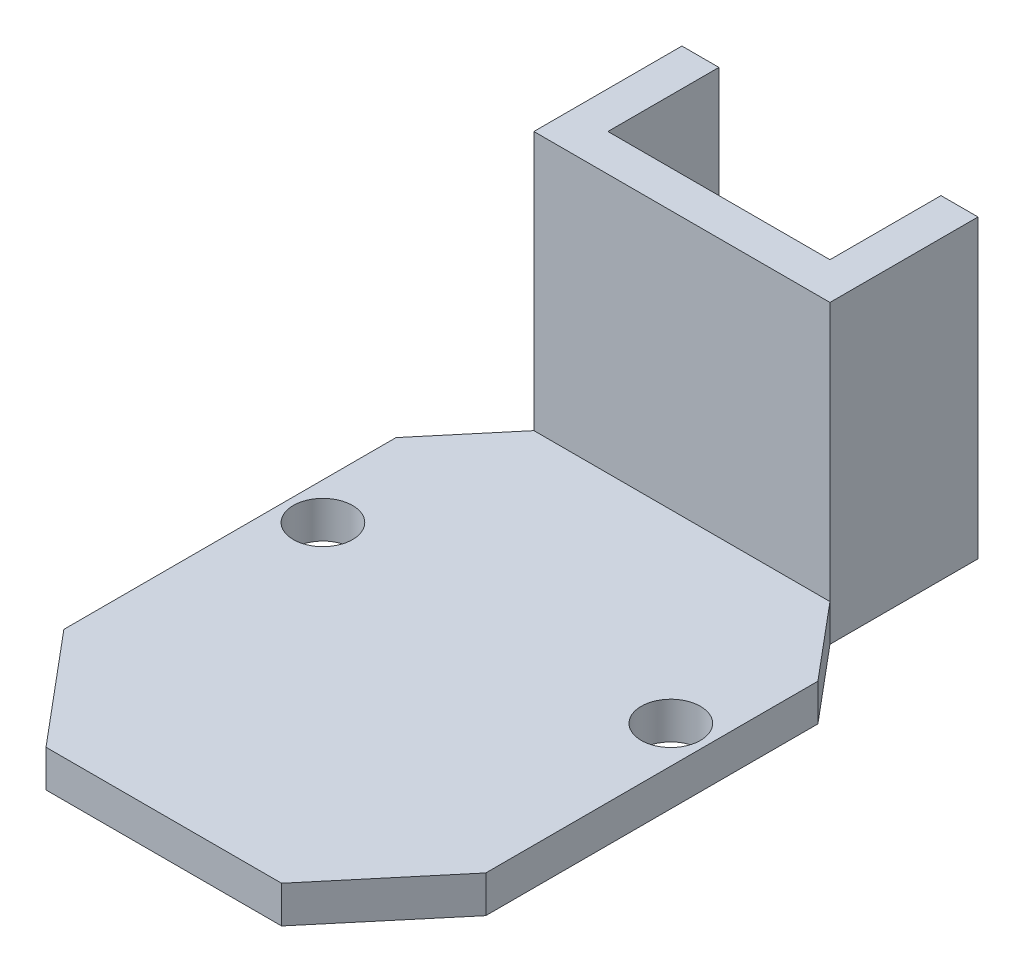
ISO-10303-21;
HEADER;
FILE_DESCRIPTION(('STEP AP214'),'2;1');
FILE_NAME('part.step','',(''),(''),'','','');
FILE_SCHEMA(('AUTOMOTIVE_DESIGN { 1 0 10303 214 1 1 1 1 }'));
ENDSEC;
DATA;
#1=APPLICATION_CONTEXT('core data for automotive mechanical design processes');
#2=APPLICATION_PROTOCOL_DEFINITION('international standard','automotive_design',2000,#1);
#3=PRODUCT_CONTEXT('',#1,'mechanical');
#4=PRODUCT('Part','Part','',(#3));
#5=PRODUCT_RELATED_PRODUCT_CATEGORY('part','',(#4));
#6=PRODUCT_DEFINITION_FORMATION('','',#4);
#7=PRODUCT_DEFINITION_CONTEXT('part definition',#1,'design');
#8=PRODUCT_DEFINITION('design','',#6,#7);
#9=PRODUCT_DEFINITION_SHAPE('','',#8);
#10=(LENGTH_UNIT() NAMED_UNIT(*) SI_UNIT(.MILLI.,.METRE.));
#11=(NAMED_UNIT(*) PLANE_ANGLE_UNIT() SI_UNIT($,.RADIAN.));
#12=(NAMED_UNIT(*) SI_UNIT($,.STERADIAN.) SOLID_ANGLE_UNIT());
#13=UNCERTAINTY_MEASURE_WITH_UNIT(LENGTH_MEASURE(1.E-05),#10,'distance_accuracy_value','');
#14=(GEOMETRIC_REPRESENTATION_CONTEXT(3) GLOBAL_UNCERTAINTY_ASSIGNED_CONTEXT((#13)) GLOBAL_UNIT_ASSIGNED_CONTEXT((#10,
#11,#12)) REPRESENTATION_CONTEXT('',''));
#15=CARTESIAN_POINT('',(0.,0.,0.));
#16=DIRECTION('',(0.,0.,1.));
#17=DIRECTION('',(1.,0.,0.));
#18=AXIS2_PLACEMENT_3D('',#15,#16,#17);
#19=CARTESIAN_POINT('',(0.,0.,20.));
#20=DIRECTION('',(0.,0.,-1.));
#21=DIRECTION('',(-1.,0.,0.));
#22=AXIS2_PLACEMENT_3D('',#19,#20,#21);
#23=PLANE('',#22);
#24=DIRECTION('',(-1.,0.,0.));
#25=VECTOR('',#24,1.);
#26=CARTESIAN_POINT('',(-8.5,5.,20.));
#27=LINE('',#26,#25);
#28=CARTESIAN_POINT('',(40.,5.,20.));
#29=VERTEX_POINT('',#28);
#30=CARTESIAN_POINT('',(0.,5.,20.));
#31=VERTEX_POINT('',#30);
#32=EDGE_CURVE('E146',#29,#31,#27,.T.);
#33=ORIENTED_EDGE('',*,*,#32,.F.);
#34=DIRECTION('',(0.,1.,0.));
#35=VECTOR('',#34,1.);
#36=CARTESIAN_POINT('',(40.,40.,20.));
#37=LINE('',#36,#35);
#38=CARTESIAN_POINT('',(40.,40.,20.));
#39=VERTEX_POINT('',#38);
#40=EDGE_CURVE('E226',#29,#39,#37,.T.);
#41=ORIENTED_EDGE('',*,*,#40,.T.);
#42=DIRECTION('',(-1.,0.,0.));
#43=VECTOR('',#42,1.);
#44=CARTESIAN_POINT('',(0.,40.,20.));
#45=LINE('',#44,#43);
#46=CARTESIAN_POINT('',(0.,40.,20.));
#47=VERTEX_POINT('',#46);
#48=EDGE_CURVE('E149',#39,#47,#45,.T.);
#49=ORIENTED_EDGE('',*,*,#48,.T.);
#50=DIRECTION('',(0.,-1.,0.));
#51=VECTOR('',#50,1.);
#52=CARTESIAN_POINT('',(0.,0.,20.));
#53=LINE('',#52,#51);
#54=EDGE_CURVE('E143',#47,#31,#53,.T.);
#55=ORIENTED_EDGE('',*,*,#54,.T.);
#56=EDGE_LOOP('',(#33,#41,#49,#55));
#57=FACE_BOUND('',#56,.T.);
#58=ADVANCED_FACE('F37',(#57),#23,.F.);
#59=CARTESIAN_POINT('',(0.,0.,20.));
#60=DIRECTION('',(0.,1.,0.));
#61=DIRECTION('',(0.,0.,1.));
#62=AXIS2_PLACEMENT_3D('',#59,#60,#61);
#63=PLANE('',#62);
#64=CARTESIAN_POINT('',(43.5,0.,45.));
#65=DIRECTION('',(0.,1.,0.));
#66=DIRECTION('',(0.,0.,-1.));
#67=AXIS2_PLACEMENT_3D('',#64,#65,#66);
#68=CIRCLE('',#67,4.);
#69=CARTESIAN_POINT('',(43.5,0.,41.));
#70=VERTEX_POINT('',#69);
#71=EDGE_CURVE('E335',#70,#70,#68,.T.);
#72=ORIENTED_EDGE('',*,*,#71,.T.);
#73=EDGE_LOOP('',(#72));
#74=FACE_BOUND('',#73,.T.);
#75=CARTESIAN_POINT('',(-3.5,0.,45.));
#76=DIRECTION('',(0.,1.,0.));
#77=DIRECTION('',(0.,0.,1.));
#78=AXIS2_PLACEMENT_3D('',#75,#76,#77);
#79=CIRCLE('',#78,4.);
#80=CARTESIAN_POINT('',(-3.5,0.,49.));
#81=VERTEX_POINT('',#80);
#82=EDGE_CURVE('E246',#81,#81,#79,.T.);
#83=ORIENTED_EDGE('',*,*,#82,.T.);
#84=EDGE_LOOP('',(#83));
#85=FACE_BOUND('',#84,.T.);
#86=DIRECTION('',(1.,0.,0.));
#87=VECTOR('',#86,1.);
#88=CARTESIAN_POINT('',(-8.5,0.,90.));
#89=LINE('',#88,#87);
#90=CARTESIAN_POINT('',(4.0864944676592,0.,90.));
#91=VERTEX_POINT('',#90);
#92=CARTESIAN_POINT('',(35.9135055323408,0.,90.));
#93=VERTEX_POINT('',#92);
#94=EDGE_CURVE('E253',#91,#93,#89,.T.);
#95=ORIENTED_EDGE('',*,*,#94,.F.);
#96=DIRECTION('',(0.642787609686538,0.,0.766044443118979));
#97=VECTOR('',#96,1.);
#98=CARTESIAN_POINT('',(4.08649446765921,0.,90.));
#99=LINE('',#98,#97);
#100=CARTESIAN_POINT('',(-8.5,0.,75.));
#101=VERTEX_POINT('',#100);
#102=EDGE_CURVE('E259',#91,#101,#99,.F.);
#103=ORIENTED_EDGE('',*,*,#102,.T.);
#104=DIRECTION('',(0.,0.,-1.));
#105=VECTOR('',#104,1.);
#106=CARTESIAN_POINT('',(-8.5,0.,90.));
#107=LINE('',#106,#105);
#108=CARTESIAN_POINT('',(-8.5,0.,30.1299055370508));
#109=VERTEX_POINT('',#108);
#110=EDGE_CURVE('E194',#101,#109,#107,.T.);
#111=ORIENTED_EDGE('',*,*,#110,.T.);
#112=DIRECTION('',(0.642787609686538,0.,-0.766044443118979));
#113=VECTOR('',#112,1.);
#114=CARTESIAN_POINT('',(0.,0.,20.));
#115=LINE('',#114,#113);
#116=CARTESIAN_POINT('',(0.,0.,20.));
#117=VERTEX_POINT('',#116);
#118=EDGE_CURVE('E247',#109,#117,#115,.T.);
#119=ORIENTED_EDGE('',*,*,#118,.T.);
#120=DIRECTION('',(0.,0.,-1.));
#121=VECTOR('',#120,1.);
#122=CARTESIAN_POINT('',(0.,0.,20.));
#123=LINE('',#122,#121);
#124=CARTESIAN_POINT('',(0.,0.,0.));
#125=VERTEX_POINT('',#124);
#126=EDGE_CURVE('E153',#117,#125,#123,.T.);
#127=ORIENTED_EDGE('',*,*,#126,.T.);
#128=DIRECTION('',(1.,0.,0.));
#129=VECTOR('',#128,1.);
#130=CARTESIAN_POINT('',(0.,0.,0.));
#131=LINE('',#130,#129);
#132=CARTESIAN_POINT('',(5.,0.,0.));
#133=VERTEX_POINT('',#132);
#134=EDGE_CURVE('E228',#125,#133,#131,.T.);
#135=ORIENTED_EDGE('',*,*,#134,.T.);
#136=DIRECTION('',(0.,0.,-1.));
#137=VECTOR('',#136,1.);
#138=CARTESIAN_POINT('',(5.,0.,15.));
#139=LINE('',#138,#137);
#140=CARTESIAN_POINT('',(5.,0.,15.));
#141=VERTEX_POINT('',#140);
#142=EDGE_CURVE('E213',#141,#133,#139,.T.);
#143=ORIENTED_EDGE('',*,*,#142,.F.);
#144=DIRECTION('',(-1.,0.,0.));
#145=VECTOR('',#144,1.);
#146=CARTESIAN_POINT('',(0.,0.,15.));
#147=LINE('',#146,#145);
#148=CARTESIAN_POINT('',(35.,0.,15.));
#149=VERTEX_POINT('',#148);
#150=EDGE_CURVE('E205',#149,#141,#147,.T.);
#151=ORIENTED_EDGE('',*,*,#150,.F.);
#152=DIRECTION('',(0.,0.,-1.));
#153=VECTOR('',#152,1.);
#154=CARTESIAN_POINT('',(35.,0.,15.));
#155=LINE('',#154,#153);
#156=CARTESIAN_POINT('',(35.,0.,0.));
#157=VERTEX_POINT('',#156);
#158=EDGE_CURVE('E216',#149,#157,#155,.T.);
#159=ORIENTED_EDGE('',*,*,#158,.T.);
#160=CARTESIAN_POINT('',(40.,0.,0.));
#161=VERTEX_POINT('',#160);
#162=EDGE_CURVE('E215',#157,#161,#131,.T.);
#163=ORIENTED_EDGE('',*,*,#162,.T.);
#164=DIRECTION('',(0.,0.,-1.));
#165=VECTOR('',#164,1.);
#166=CARTESIAN_POINT('',(40.,0.,20.));
#167=LINE('',#166,#165);
#168=CARTESIAN_POINT('',(40.,0.,20.));
#169=VERTEX_POINT('',#168);
#170=EDGE_CURVE('E176',#169,#161,#167,.T.);
#171=ORIENTED_EDGE('',*,*,#170,.F.);
#172=DIRECTION('',(0.642787609686538,0.,0.766044443118979));
#173=VECTOR('',#172,1.);
#174=CARTESIAN_POINT('',(40.,0.,20.));
#175=LINE('',#174,#173);
#176=CARTESIAN_POINT('',(48.5,0.,30.1299055370508));
#177=VERTEX_POINT('',#176);
#178=EDGE_CURVE('E245',#169,#177,#175,.T.);
#179=ORIENTED_EDGE('',*,*,#178,.T.);
#180=DIRECTION('',(0.,0.,-1.));
#181=VECTOR('',#180,1.);
#182=CARTESIAN_POINT('',(48.5,0.,90.));
#183=LINE('',#182,#181);
#184=CARTESIAN_POINT('',(48.5,0.,74.9999999999999));
#185=VERTEX_POINT('',#184);
#186=EDGE_CURVE('E192',#185,#177,#183,.T.);
#187=ORIENTED_EDGE('',*,*,#186,.F.);
#188=DIRECTION('',(0.642787609686537,0.,-0.76604444311898));
#189=VECTOR('',#188,1.);
#190=CARTESIAN_POINT('',(35.9135055323408,0.,90.));
#191=LINE('',#190,#189);
#192=EDGE_CURVE('E257',#185,#93,#191,.F.);
#193=ORIENTED_EDGE('',*,*,#192,.T.);
#194=EDGE_LOOP('',(#95,#103,#111,#119,#127,#135,#143,#151,#159,#163,#171,#179,#187,#193));
#195=FACE_BOUND('',#194,.T.);
#196=ADVANCED_FACE('F273',(#74,#85,#195),#63,.F.);
#197=CARTESIAN_POINT('',(0.,40.,20.));
#198=DIRECTION('',(0.,-1.,0.));
#199=DIRECTION('',(0.,0.,-1.));
#200=AXIS2_PLACEMENT_3D('',#197,#198,#199);
#201=PLANE('',#200);
#202=DIRECTION('',(0.,0.,-1.));
#203=VECTOR('',#202,1.);
#204=CARTESIAN_POINT('',(5.,40.,15.));
#205=LINE('',#204,#203);
#206=CARTESIAN_POINT('',(5.,40.,15.));
#207=VERTEX_POINT('',#206);
#208=CARTESIAN_POINT('',(5.,40.,0.));
#209=VERTEX_POINT('',#208);
#210=EDGE_CURVE('E208',#207,#209,#205,.T.);
#211=ORIENTED_EDGE('',*,*,#210,.T.);
#212=DIRECTION('',(-1.,0.,0.));
#213=VECTOR('',#212,1.);
#214=CARTESIAN_POINT('',(0.,40.,0.));
#215=LINE('',#214,#213);
#216=CARTESIAN_POINT('',(0.,40.,0.));
#217=VERTEX_POINT('',#216);
#218=EDGE_CURVE('E233',#209,#217,#215,.T.);
#219=ORIENTED_EDGE('',*,*,#218,.T.);
#220=DIRECTION('',(0.,0.,-1.));
#221=VECTOR('',#220,1.);
#222=CARTESIAN_POINT('',(0.,40.,20.));
#223=LINE('',#222,#221);
#224=EDGE_CURVE('E240',#47,#217,#223,.T.);
#225=ORIENTED_EDGE('',*,*,#224,.F.);
#226=ORIENTED_EDGE('',*,*,#48,.F.);
#227=DIRECTION('',(0.,0.,-1.));
#228=VECTOR('',#227,1.);
#229=CARTESIAN_POINT('',(40.,40.,20.));
#230=LINE('',#229,#228);
#231=CARTESIAN_POINT('',(40.,40.,0.));
#232=VERTEX_POINT('',#231);
#233=EDGE_CURVE('E182',#39,#232,#230,.T.);
#234=ORIENTED_EDGE('',*,*,#233,.T.);
#235=CARTESIAN_POINT('',(35.,40.,0.));
#236=VERTEX_POINT('',#235);
#237=EDGE_CURVE('E234',#232,#236,#215,.T.);
#238=ORIENTED_EDGE('',*,*,#237,.T.);
#239=DIRECTION('',(0.,0.,-1.));
#240=VECTOR('',#239,1.);
#241=CARTESIAN_POINT('',(35.,40.,15.));
#242=LINE('',#241,#240);
#243=CARTESIAN_POINT('',(35.,40.,15.));
#244=VERTEX_POINT('',#243);
#245=EDGE_CURVE('E219',#244,#236,#242,.T.);
#246=ORIENTED_EDGE('',*,*,#245,.F.);
#247=DIRECTION('',(1.,0.,0.));
#248=VECTOR('',#247,1.);
#249=CARTESIAN_POINT('',(0.,40.,15.));
#250=LINE('',#249,#248);
#251=EDGE_CURVE('E199',#207,#244,#250,.T.);
#252=ORIENTED_EDGE('',*,*,#251,.F.);
#253=EDGE_LOOP('',(#211,#219,#225,#226,#234,#238,#246,#252));
#254=FACE_BOUND('',#253,.T.);
#255=ADVANCED_FACE('F294',(#254),#201,.F.);
#256=CARTESIAN_POINT('',(0.,0.,0.));
#257=DIRECTION('',(0.,0.,-1.));
#258=DIRECTION('',(-1.,0.,0.));
#259=AXIS2_PLACEMENT_3D('',#256,#257,#258);
#260=PLANE('',#259);
#261=ORIENTED_EDGE('',*,*,#218,.F.);
#262=DIRECTION('',(0.,-1.,0.));
#263=VECTOR('',#262,1.);
#264=CARTESIAN_POINT('',(5.,0.,0.));
#265=LINE('',#264,#263);
#266=EDGE_CURVE('E196',#209,#133,#265,.T.);
#267=ORIENTED_EDGE('',*,*,#266,.T.);
#268=ORIENTED_EDGE('',*,*,#134,.F.);
#269=DIRECTION('',(0.,-1.,0.));
#270=VECTOR('',#269,1.);
#271=CARTESIAN_POINT('',(0.,0.,0.));
#272=LINE('',#271,#270);
#273=EDGE_CURVE('E237',#217,#125,#272,.T.);
#274=ORIENTED_EDGE('',*,*,#273,.F.);
#275=EDGE_LOOP('',(#261,#267,#268,#274));
#276=FACE_BOUND('',#275,.T.);
#277=ADVANCED_FACE('F301',(#276),#260,.T.);
#278=ORIENTED_EDGE('',*,*,#162,.F.);
#279=DIRECTION('',(0.,1.,0.));
#280=VECTOR('',#279,1.);
#281=CARTESIAN_POINT('',(35.,0.,0.));
#282=LINE('',#281,#280);
#283=EDGE_CURVE('E200',#157,#236,#282,.T.);
#284=ORIENTED_EDGE('',*,*,#283,.T.);
#285=ORIENTED_EDGE('',*,*,#237,.F.);
#286=DIRECTION('',(0.,1.,0.));
#287=VECTOR('',#286,1.);
#288=CARTESIAN_POINT('',(40.,40.,0.));
#289=LINE('',#288,#287);
#290=EDGE_CURVE('E231',#161,#232,#289,.T.);
#291=ORIENTED_EDGE('',*,*,#290,.F.);
#292=EDGE_LOOP('',(#278,#284,#285,#291));
#293=FACE_BOUND('',#292,.T.);
#294=ADVANCED_FACE('F304',(#293),#260,.T.);
#295=CARTESIAN_POINT('',(40.,40.,20.));
#296=DIRECTION('',(-1.,0.,0.));
#297=DIRECTION('',(0.,-1.,0.));
#298=AXIS2_PLACEMENT_3D('',#295,#296,#297);
#299=PLANE('',#298);
#300=ORIENTED_EDGE('',*,*,#290,.T.);
#301=ORIENTED_EDGE('',*,*,#233,.F.);
#302=ORIENTED_EDGE('',*,*,#40,.F.);
#303=EDGE_CURVE('E223',#169,#29,#37,.T.);
#304=ORIENTED_EDGE('',*,*,#303,.F.);
#305=ORIENTED_EDGE('',*,*,#170,.T.);
#306=EDGE_LOOP('',(#300,#301,#302,#304,#305));
#307=FACE_BOUND('',#306,.T.);
#308=ADVANCED_FACE('F308',(#307),#299,.F.);
#309=CARTESIAN_POINT('',(0.,0.,20.));
#310=DIRECTION('',(1.,0.,0.));
#311=DIRECTION('',(0.,0.,-1.));
#312=AXIS2_PLACEMENT_3D('',#309,#310,#311);
#313=PLANE('',#312);
#314=ORIENTED_EDGE('',*,*,#273,.T.);
#315=ORIENTED_EDGE('',*,*,#126,.F.);
#316=EDGE_CURVE('E154',#31,#117,#53,.T.);
#317=ORIENTED_EDGE('',*,*,#316,.F.);
#318=ORIENTED_EDGE('',*,*,#54,.F.);
#319=ORIENTED_EDGE('',*,*,#224,.T.);
#320=EDGE_LOOP('',(#314,#315,#317,#318,#319));
#321=FACE_BOUND('',#320,.T.);
#322=ADVANCED_FACE('F158',(#321),#313,.F.);
#323=CARTESIAN_POINT('',(5.,0.,15.));
#324=DIRECTION('',(1.,0.,0.));
#325=DIRECTION('',(0.,1.,0.));
#326=AXIS2_PLACEMENT_3D('',#323,#324,#325);
#327=PLANE('',#326);
#328=ORIENTED_EDGE('',*,*,#266,.F.);
#329=ORIENTED_EDGE('',*,*,#210,.F.);
#330=DIRECTION('',(0.,-1.,0.));
#331=VECTOR('',#330,1.);
#332=CARTESIAN_POINT('',(5.,0.,15.));
#333=LINE('',#332,#331);
#334=EDGE_CURVE('E197',#207,#141,#333,.T.);
#335=ORIENTED_EDGE('',*,*,#334,.T.);
#336=ORIENTED_EDGE('',*,*,#142,.T.);
#337=EDGE_LOOP('',(#328,#329,#335,#336));
#338=FACE_BOUND('',#337,.T.);
#339=ADVANCED_FACE('F299',(#338),#327,.T.);
#340=CARTESIAN_POINT('',(35.,0.,15.));
#341=DIRECTION('',(-1.,0.,0.));
#342=DIRECTION('',(0.,0.,1.));
#343=AXIS2_PLACEMENT_3D('',#340,#341,#342);
#344=PLANE('',#343);
#345=ORIENTED_EDGE('',*,*,#283,.F.);
#346=ORIENTED_EDGE('',*,*,#158,.F.);
#347=DIRECTION('',(0.,1.,0.));
#348=VECTOR('',#347,1.);
#349=CARTESIAN_POINT('',(35.,0.,15.));
#350=LINE('',#349,#348);
#351=EDGE_CURVE('E203',#149,#244,#350,.T.);
#352=ORIENTED_EDGE('',*,*,#351,.T.);
#353=ORIENTED_EDGE('',*,*,#245,.T.);
#354=EDGE_LOOP('',(#345,#346,#352,#353));
#355=FACE_BOUND('',#354,.T.);
#356=ADVANCED_FACE('F446',(#355),#344,.T.);
#357=CARTESIAN_POINT('',(0.,0.,15.));
#358=DIRECTION('',(0.,0.,-1.));
#359=DIRECTION('',(-1.,0.,0.));
#360=AXIS2_PLACEMENT_3D('',#357,#358,#359);
#361=PLANE('',#360);
#362=ORIENTED_EDGE('',*,*,#334,.F.);
#363=ORIENTED_EDGE('',*,*,#251,.T.);
#364=ORIENTED_EDGE('',*,*,#351,.F.);
#365=ORIENTED_EDGE('',*,*,#150,.T.);
#366=EDGE_LOOP('',(#362,#363,#364,#365));
#367=FACE_BOUND('',#366,.T.);
#368=ADVANCED_FACE('F285',(#367),#361,.T.);
#369=CARTESIAN_POINT('',(40.,40.,20.));
#370=DIRECTION('',(0.766044443118979,0.,-0.642787609686538));
#371=DIRECTION('',(-0.642787609686538,0.,-0.766044443118979));
#372=AXIS2_PLACEMENT_3D('',#369,#370,#371);
#373=PLANE('',#372);
#374=ORIENTED_EDGE('',*,*,#178,.F.);
#375=ORIENTED_EDGE('',*,*,#303,.T.);
#376=DIRECTION('',(-0.642787609686538,0.,-0.766044443118979));
#377=VECTOR('',#376,1.);
#378=CARTESIAN_POINT('',(40.,5.,20.));
#379=LINE('',#378,#377);
#380=CARTESIAN_POINT('',(48.5,5.,30.1299055370508));
#381=VERTEX_POINT('',#380);
#382=EDGE_CURVE('E169',#381,#29,#379,.T.);
#383=ORIENTED_EDGE('',*,*,#382,.F.);
#384=DIRECTION('',(0.,1.,0.));
#385=VECTOR('',#384,1.);
#386=CARTESIAN_POINT('',(48.5,40.,30.1299055370508));
#387=LINE('',#386,#385);
#388=EDGE_CURVE('E170',#177,#381,#387,.T.);
#389=ORIENTED_EDGE('',*,*,#388,.F.);
#390=EDGE_LOOP('',(#374,#375,#383,#389));
#391=FACE_BOUND('',#390,.T.);
#392=ADVANCED_FACE('F277',(#391),#373,.T.);
#393=CARTESIAN_POINT('',(-8.5,0.,90.));
#394=DIRECTION('',(1.,0.,0.));
#395=DIRECTION('',(0.,0.,-1.));
#396=AXIS2_PLACEMENT_3D('',#393,#394,#395);
#397=PLANE('',#396);
#398=ORIENTED_EDGE('',*,*,#110,.F.);
#399=DIRECTION('',(0.,1.,0.));
#400=VECTOR('',#399,1.);
#401=CARTESIAN_POINT('',(-8.5,0.,75.));
#402=LINE('',#401,#400);
#403=CARTESIAN_POINT('',(-8.5,5.,75.));
#404=VERTEX_POINT('',#403);
#405=EDGE_CURVE('E60',#101,#404,#402,.T.);
#406=ORIENTED_EDGE('',*,*,#405,.T.);
#407=DIRECTION('',(0.,0.,-1.));
#408=VECTOR('',#407,1.);
#409=CARTESIAN_POINT('',(-8.5,5.,90.));
#410=LINE('',#409,#408);
#411=CARTESIAN_POINT('',(-8.5,5.,30.1299055370508));
#412=VERTEX_POINT('',#411);
#413=EDGE_CURVE('E188',#404,#412,#410,.T.);
#414=ORIENTED_EDGE('',*,*,#413,.T.);
#415=DIRECTION('',(0.,-1.,0.));
#416=VECTOR('',#415,1.);
#417=CARTESIAN_POINT('',(-8.5,0.,30.1299055370508));
#418=LINE('',#417,#416);
#419=EDGE_CURVE('E168',#412,#109,#418,.T.);
#420=ORIENTED_EDGE('',*,*,#419,.T.);
#421=EDGE_LOOP('',(#398,#406,#414,#420));
#422=FACE_BOUND('',#421,.T.);
#423=ADVANCED_FACE('F274',(#422),#397,.F.);
#424=CARTESIAN_POINT('',(48.5,5.,90.));
#425=DIRECTION('',(-1.,0.,0.));
#426=DIRECTION('',(0.,0.,1.));
#427=AXIS2_PLACEMENT_3D('',#424,#425,#426);
#428=PLANE('',#427);
#429=DIRECTION('',(0.,0.,-1.));
#430=VECTOR('',#429,1.);
#431=CARTESIAN_POINT('',(48.5,5.,90.));
#432=LINE('',#431,#430);
#433=CARTESIAN_POINT('',(48.5,5.,74.9999999999999));
#434=VERTEX_POINT('',#433);
#435=EDGE_CURVE('E190',#434,#381,#432,.T.);
#436=ORIENTED_EDGE('',*,*,#435,.F.);
#437=DIRECTION('',(0.,-1.,0.));
#438=VECTOR('',#437,1.);
#439=CARTESIAN_POINT('',(48.5,5.,74.9999999999999));
#440=LINE('',#439,#438);
#441=EDGE_CURVE('E11',#434,#185,#440,.T.);
#442=ORIENTED_EDGE('',*,*,#441,.T.);
#443=ORIENTED_EDGE('',*,*,#186,.T.);
#444=ORIENTED_EDGE('',*,*,#388,.T.);
#445=EDGE_LOOP('',(#436,#442,#443,#444));
#446=FACE_BOUND('',#445,.T.);
#447=ADVANCED_FACE('F276',(#446),#428,.F.);
#448=CARTESIAN_POINT('',(-8.5,5.,90.));
#449=DIRECTION('',(0.,-1.,0.));
#450=DIRECTION('',(0.,0.,-1.));
#451=AXIS2_PLACEMENT_3D('',#448,#449,#450);
#452=PLANE('',#451);
#453=CARTESIAN_POINT('',(43.5,5.,45.));
#454=DIRECTION('',(0.,1.,0.));
#455=DIRECTION('',(0.,0.,-1.));
#456=AXIS2_PLACEMENT_3D('',#453,#454,#455);
#457=CIRCLE('',#456,4.);
#458=CARTESIAN_POINT('',(43.5,5.,41.));
#459=VERTEX_POINT('',#458);
#460=EDGE_CURVE('E338',#459,#459,#457,.T.);
#461=ORIENTED_EDGE('',*,*,#460,.F.);
#462=EDGE_LOOP('',(#461));
#463=FACE_BOUND('',#462,.T.);
#464=CARTESIAN_POINT('',(-3.5,5.,45.));
#465=DIRECTION('',(0.,1.,0.));
#466=DIRECTION('',(0.,0.,1.));
#467=AXIS2_PLACEMENT_3D('',#464,#465,#466);
#468=CIRCLE('',#467,4.);
#469=CARTESIAN_POINT('',(-3.5,5.,49.));
#470=VERTEX_POINT('',#469);
#471=EDGE_CURVE('E332',#470,#470,#468,.T.);
#472=ORIENTED_EDGE('',*,*,#471,.F.);
#473=EDGE_LOOP('',(#472));
#474=FACE_BOUND('',#473,.T.);
#475=ORIENTED_EDGE('',*,*,#413,.F.);
#476=DIRECTION('',(-0.642787609686538,0.,-0.766044443118979));
#477=VECTOR('',#476,1.);
#478=CARTESIAN_POINT('',(4.08649446765921,5.,90.));
#479=LINE('',#478,#477);
#480=CARTESIAN_POINT('',(4.0864944676592,5.,90.));
#481=VERTEX_POINT('',#480);
#482=EDGE_CURVE('E45',#404,#481,#479,.F.);
#483=ORIENTED_EDGE('',*,*,#482,.T.);
#484=DIRECTION('',(-1.,0.,0.));
#485=VECTOR('',#484,1.);
#486=CARTESIAN_POINT('',(-8.5,5.,90.));
#487=LINE('',#486,#485);
#488=CARTESIAN_POINT('',(35.9135055323408,5.,90.));
#489=VERTEX_POINT('',#488);
#490=EDGE_CURVE('E186',#489,#481,#487,.T.);
#491=ORIENTED_EDGE('',*,*,#490,.F.);
#492=DIRECTION('',(-0.642787609686537,0.,0.76604444311898));
#493=VECTOR('',#492,1.);
#494=CARTESIAN_POINT('',(35.9135055323408,5.,90.));
#495=LINE('',#494,#493);
#496=EDGE_CURVE('E52',#489,#434,#495,.F.);
#497=ORIENTED_EDGE('',*,*,#496,.T.);
#498=ORIENTED_EDGE('',*,*,#435,.T.);
#499=ORIENTED_EDGE('',*,*,#382,.T.);
#500=ORIENTED_EDGE('',*,*,#32,.T.);
#501=DIRECTION('',(-0.642787609686538,0.,0.766044443118979));
#502=VECTOR('',#501,1.);
#503=CARTESIAN_POINT('',(0.,5.,20.));
#504=LINE('',#503,#502);
#505=EDGE_CURVE('E165',#31,#412,#504,.T.);
#506=ORIENTED_EDGE('',*,*,#505,.T.);
#507=EDGE_LOOP('',(#475,#483,#491,#497,#498,#499,#500,#506));
#508=FACE_BOUND('',#507,.T.);
#509=ADVANCED_FACE('F173',(#463,#474,#508),#452,.F.);
#510=CARTESIAN_POINT('',(0.,0.,90.));
#511=DIRECTION('',(0.,0.,-1.));
#512=DIRECTION('',(-1.,0.,0.));
#513=AXIS2_PLACEMENT_3D('',#510,#511,#512);
#514=PLANE('',#513);
#515=ORIENTED_EDGE('',*,*,#490,.T.);
#516=DIRECTION('',(0.,-1.,0.));
#517=VECTOR('',#516,1.);
#518=CARTESIAN_POINT('',(4.08649446765921,0.,90.));
#519=LINE('',#518,#517);
#520=EDGE_CURVE('E179',#481,#91,#519,.T.);
#521=ORIENTED_EDGE('',*,*,#520,.T.);
#522=ORIENTED_EDGE('',*,*,#94,.T.);
#523=DIRECTION('',(0.,1.,0.));
#524=VECTOR('',#523,1.);
#525=CARTESIAN_POINT('',(35.9135055323408,0.,90.));
#526=LINE('',#525,#524);
#527=EDGE_CURVE('E175',#93,#489,#526,.T.);
#528=ORIENTED_EDGE('',*,*,#527,.T.);
#529=EDGE_LOOP('',(#515,#521,#522,#528));
#530=FACE_BOUND('',#529,.T.);
#531=ADVANCED_FACE('F267',(#530),#514,.F.);
#532=CARTESIAN_POINT('',(0.,0.,20.));
#533=DIRECTION('',(-0.766044443118979,0.,-0.642787609686538));
#534=DIRECTION('',(-0.642787609686538,0.,0.766044443118979));
#535=AXIS2_PLACEMENT_3D('',#532,#533,#534);
#536=PLANE('',#535);
#537=ORIENTED_EDGE('',*,*,#505,.F.);
#538=ORIENTED_EDGE('',*,*,#316,.T.);
#539=ORIENTED_EDGE('',*,*,#118,.F.);
#540=ORIENTED_EDGE('',*,*,#419,.F.);
#541=EDGE_LOOP('',(#537,#538,#539,#540));
#542=FACE_BOUND('',#541,.T.);
#543=ADVANCED_FACE('F166',(#542),#536,.T.);
#544=CARTESIAN_POINT('',(4.08649446765921,0.,90.));
#545=DIRECTION('',(0.766044443118979,0.,-0.642787609686538));
#546=DIRECTION('',(0.,-1.,0.));
#547=AXIS2_PLACEMENT_3D('',#544,#545,#546);
#548=PLANE('',#547);
#549=ORIENTED_EDGE('',*,*,#482,.F.);
#550=ORIENTED_EDGE('',*,*,#405,.F.);
#551=ORIENTED_EDGE('',*,*,#102,.F.);
#552=ORIENTED_EDGE('',*,*,#520,.F.);
#553=EDGE_LOOP('',(#549,#550,#551,#552));
#554=FACE_BOUND('',#553,.T.);
#555=ADVANCED_FACE('F271',(#554),#548,.F.);
#556=CARTESIAN_POINT('',(35.9135055323408,0.,90.));
#557=DIRECTION('',(-0.76604444311898,0.,-0.642787609686537));
#558=DIRECTION('',(0.,1.,0.));
#559=AXIS2_PLACEMENT_3D('',#556,#557,#558);
#560=PLANE('',#559);
#561=ORIENTED_EDGE('',*,*,#192,.F.);
#562=ORIENTED_EDGE('',*,*,#441,.F.);
#563=ORIENTED_EDGE('',*,*,#496,.F.);
#564=ORIENTED_EDGE('',*,*,#527,.F.);
#565=EDGE_LOOP('',(#561,#562,#563,#564));
#566=FACE_BOUND('',#565,.T.);
#567=ADVANCED_FACE('F39',(#566),#560,.F.);
#568=CARTESIAN_POINT('',(-3.5,0.,45.));
#569=DIRECTION('',(0.,1.,0.));
#570=DIRECTION('',(0.,0.,1.));
#571=AXIS2_PLACEMENT_3D('',#568,#569,#570);
#572=CYLINDRICAL_SURFACE('',#571,4.);
#573=ORIENTED_EDGE('',*,*,#82,.F.);
#574=EDGE_LOOP('',(#573));
#575=FACE_BOUND('',#574,.T.);
#576=ORIENTED_EDGE('',*,*,#471,.T.);
#577=EDGE_LOOP('',(#576));
#578=FACE_BOUND('',#577,.T.);
#579=ADVANCED_FACE('F320',(#575,#578),#572,.F.);
#580=CARTESIAN_POINT('',(43.5,0.,45.));
#581=DIRECTION('',(0.,1.,0.));
#582=DIRECTION('',(0.,0.,1.));
#583=AXIS2_PLACEMENT_3D('',#580,#581,#582);
#584=CYLINDRICAL_SURFACE('',#583,4.);
#585=ORIENTED_EDGE('',*,*,#71,.F.);
#586=EDGE_LOOP('',(#585));
#587=FACE_BOUND('',#586,.T.);
#588=ORIENTED_EDGE('',*,*,#460,.T.);
#589=EDGE_LOOP('',(#588));
#590=FACE_BOUND('',#589,.T.);
#591=ADVANCED_FACE('F325',(#587,#590),#584,.F.);
#592=CLOSED_SHELL('',(#58,#196,#255,#277,#294,#308,#322,#339,#356,#368,#392,#423,#447,#509,#531,
#543,#555,#567,#579,#591));
#593=MANIFOLD_SOLID_BREP('B2',#592);
#594=ADVANCED_BREP_SHAPE_REPRESENTATION('',(#18,#593),#14);
#595=SHAPE_DEFINITION_REPRESENTATION(#9,#594);
ENDSEC;
END-ISO-10303-21;
